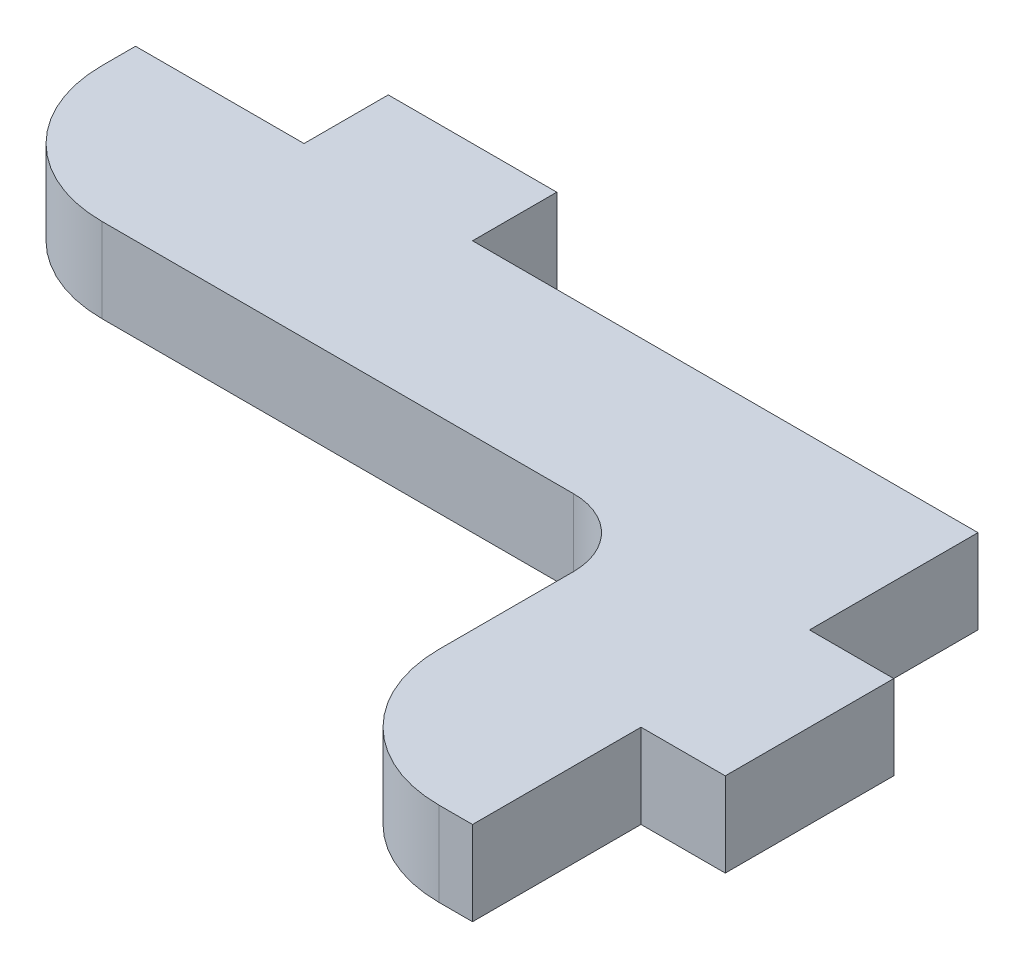
ISO-10303-21;
HEADER;
FILE_DESCRIPTION(('STEP AP214'),'2;1');
FILE_NAME('part.step','',(''),(''),'','','');
FILE_SCHEMA(('AUTOMOTIVE_DESIGN { 1 0 10303 214 1 1 1 1 }'));
ENDSEC;
DATA;
#1=APPLICATION_CONTEXT('core data for automotive mechanical design processes');
#2=APPLICATION_PROTOCOL_DEFINITION('international standard','automotive_design',2000,#1);
#3=PRODUCT_CONTEXT('',#1,'mechanical');
#4=PRODUCT('Part','Part','',(#3));
#5=PRODUCT_RELATED_PRODUCT_CATEGORY('part','',(#4));
#6=PRODUCT_DEFINITION_FORMATION('','',#4);
#7=PRODUCT_DEFINITION_CONTEXT('part definition',#1,'design');
#8=PRODUCT_DEFINITION('design','',#6,#7);
#9=PRODUCT_DEFINITION_SHAPE('','',#8);
#10=(LENGTH_UNIT() NAMED_UNIT(*) SI_UNIT(.MILLI.,.METRE.));
#11=(NAMED_UNIT(*) PLANE_ANGLE_UNIT() SI_UNIT($,.RADIAN.));
#12=(NAMED_UNIT(*) SI_UNIT($,.STERADIAN.) SOLID_ANGLE_UNIT());
#13=UNCERTAINTY_MEASURE_WITH_UNIT(LENGTH_MEASURE(1.E-05),#10,'distance_accuracy_value','');
#14=(GEOMETRIC_REPRESENTATION_CONTEXT(3) GLOBAL_UNCERTAINTY_ASSIGNED_CONTEXT((#13)) GLOBAL_UNIT_ASSIGNED_CONTEXT((#10,
#11,#12)) REPRESENTATION_CONTEXT('',''));
#15=CARTESIAN_POINT('',(0.,0.,0.));
#16=DIRECTION('',(0.,0.,1.));
#17=DIRECTION('',(1.,0.,0.));
#18=AXIS2_PLACEMENT_3D('',#15,#16,#17);
#19=CARTESIAN_POINT('',(50.,5.,20.));
#20=DIRECTION('',(-1.,0.,0.));
#21=DIRECTION('',(0.,0.,1.));
#22=AXIS2_PLACEMENT_3D('',#19,#20,#21);
#23=PLANE('',#22);
#24=DIRECTION('',(0.,0.,-1.));
#25=VECTOR('',#24,1.);
#26=CARTESIAN_POINT('',(50.,0.,20.));
#27=LINE('',#26,#25);
#28=CARTESIAN_POINT('',(50.,0.,20.));
#29=VERTEX_POINT('',#28);
#30=CARTESIAN_POINT('',(50.,0.,9.99999999999999));
#31=VERTEX_POINT('',#30);
#32=EDGE_CURVE('E185',#29,#31,#27,.T.);
#33=ORIENTED_EDGE('',*,*,#32,.T.);
#34=DIRECTION('',(0.,-1.,0.));
#35=VECTOR('',#34,1.);
#36=CARTESIAN_POINT('',(50.,5.,9.99999999999999));
#37=LINE('',#36,#35);
#38=CARTESIAN_POINT('',(50.,5.,9.99999999999999));
#39=VERTEX_POINT('',#38);
#40=EDGE_CURVE('E11',#39,#31,#37,.T.);
#41=ORIENTED_EDGE('',*,*,#40,.F.);
#42=DIRECTION('',(0.,0.,-1.));
#43=VECTOR('',#42,1.);
#44=CARTESIAN_POINT('',(50.,5.,20.));
#45=LINE('',#44,#43);
#46=CARTESIAN_POINT('',(50.,5.,20.));
#47=VERTEX_POINT('',#46);
#48=EDGE_CURVE('E217',#47,#39,#45,.T.);
#49=ORIENTED_EDGE('',*,*,#48,.F.);
#50=DIRECTION('',(0.,-1.,0.));
#51=VECTOR('',#50,1.);
#52=CARTESIAN_POINT('',(50.,5.,20.));
#53=LINE('',#52,#51);
#54=EDGE_CURVE('E181',#47,#29,#53,.T.);
#55=ORIENTED_EDGE('',*,*,#54,.T.);
#56=EDGE_LOOP('',(#33,#41,#49,#55));
#57=FACE_BOUND('',#56,.T.);
#58=ADVANCED_FACE('F35',(#57),#23,.F.);
#59=CARTESIAN_POINT('',(50.,5.,9.99999999999999));
#60=DIRECTION('',(0.,0.,-1.));
#61=DIRECTION('',(-1.,0.,0.));
#62=AXIS2_PLACEMENT_3D('',#59,#60,#61);
#63=PLANE('',#62);
#64=DIRECTION('',(1.,0.,0.));
#65=VECTOR('',#64,1.);
#66=CARTESIAN_POINT('',(50.,0.,9.99999999999999));
#67=LINE('',#66,#65);
#68=CARTESIAN_POINT('',(55.,0.,9.99999999999999));
#69=VERTEX_POINT('',#68);
#70=EDGE_CURVE('E188',#31,#69,#67,.T.);
#71=ORIENTED_EDGE('',*,*,#70,.T.);
#72=DIRECTION('',(0.,-1.,0.));
#73=VECTOR('',#72,1.);
#74=CARTESIAN_POINT('',(55.,5.,9.99999999999999));
#75=LINE('',#74,#73);
#76=CARTESIAN_POINT('',(55.,5.,9.99999999999999));
#77=VERTEX_POINT('',#76);
#78=EDGE_CURVE('E43',#77,#69,#75,.T.);
#79=ORIENTED_EDGE('',*,*,#78,.F.);
#80=DIRECTION('',(1.,0.,0.));
#81=VECTOR('',#80,1.);
#82=CARTESIAN_POINT('',(50.,5.,9.99999999999999));
#83=LINE('',#82,#81);
#84=EDGE_CURVE('E121',#39,#77,#83,.T.);
#85=ORIENTED_EDGE('',*,*,#84,.F.);
#86=ORIENTED_EDGE('',*,*,#40,.T.);
#87=EDGE_LOOP('',(#71,#79,#85,#86));
#88=FACE_BOUND('',#87,.T.);
#89=ADVANCED_FACE('F320',(#88),#63,.F.);
#90=CARTESIAN_POINT('',(55.,5.,0.));
#91=DIRECTION('',(-1.,0.,0.));
#92=DIRECTION('',(0.,0.,1.));
#93=AXIS2_PLACEMENT_3D('',#90,#91,#92);
#94=PLANE('',#93);
#95=DIRECTION('',(0.,0.,-1.));
#96=VECTOR('',#95,1.);
#97=CARTESIAN_POINT('',(55.,0.,0.));
#98=LINE('',#97,#96);
#99=CARTESIAN_POINT('',(55.,0.,0.));
#100=VERTEX_POINT('',#99);
#101=EDGE_CURVE('E190',#69,#100,#98,.T.);
#102=ORIENTED_EDGE('',*,*,#101,.T.);
#103=DIRECTION('',(0.,-1.,0.));
#104=VECTOR('',#103,1.);
#105=CARTESIAN_POINT('',(55.,5.,0.));
#106=LINE('',#105,#104);
#107=CARTESIAN_POINT('',(55.,5.,0.));
#108=VERTEX_POINT('',#107);
#109=EDGE_CURVE('E251',#108,#100,#106,.T.);
#110=ORIENTED_EDGE('',*,*,#109,.F.);
#111=DIRECTION('',(0.,0.,-1.));
#112=VECTOR('',#111,1.);
#113=CARTESIAN_POINT('',(55.,5.,0.));
#114=LINE('',#113,#112);
#115=EDGE_CURVE('E259',#77,#108,#114,.T.);
#116=ORIENTED_EDGE('',*,*,#115,.F.);
#117=ORIENTED_EDGE('',*,*,#78,.T.);
#118=EDGE_LOOP('',(#102,#110,#116,#117));
#119=FACE_BOUND('',#118,.T.);
#120=ADVANCED_FACE('F257',(#119),#94,.F.);
#121=CARTESIAN_POINT('',(50.,5.,0.));
#122=DIRECTION('',(0.,0.,1.));
#123=DIRECTION('',(1.,0.,0.));
#124=AXIS2_PLACEMENT_3D('',#121,#122,#123);
#125=PLANE('',#124);
#126=DIRECTION('',(-1.,0.,0.));
#127=VECTOR('',#126,1.);
#128=CARTESIAN_POINT('',(50.,0.,0.));
#129=LINE('',#128,#127);
#130=CARTESIAN_POINT('',(50.,0.,0.));
#131=VERTEX_POINT('',#130);
#132=EDGE_CURVE('E192',#100,#131,#129,.T.);
#133=ORIENTED_EDGE('',*,*,#132,.T.);
#134=DIRECTION('',(0.,-1.,0.));
#135=VECTOR('',#134,1.);
#136=CARTESIAN_POINT('',(50.,5.,0.));
#137=LINE('',#136,#135);
#138=CARTESIAN_POINT('',(50.,5.,0.));
#139=VERTEX_POINT('',#138);
#140=EDGE_CURVE('E248',#139,#131,#137,.T.);
#141=ORIENTED_EDGE('',*,*,#140,.F.);
#142=DIRECTION('',(-1.,0.,0.));
#143=VECTOR('',#142,1.);
#144=CARTESIAN_POINT('',(50.,5.,0.));
#145=LINE('',#144,#143);
#146=EDGE_CURVE('E277',#108,#139,#145,.T.);
#147=ORIENTED_EDGE('',*,*,#146,.F.);
#148=ORIENTED_EDGE('',*,*,#109,.T.);
#149=EDGE_LOOP('',(#133,#141,#147,#148));
#150=FACE_BOUND('',#149,.T.);
#151=ADVANCED_FACE('F268',(#150),#125,.F.);
#152=CARTESIAN_POINT('',(50.,5.,0.));
#153=DIRECTION('',(-1.,0.,0.));
#154=DIRECTION('',(0.,0.,1.));
#155=AXIS2_PLACEMENT_3D('',#152,#153,#154);
#156=PLANE('',#155);
#157=DIRECTION('',(0.,0.,-1.));
#158=VECTOR('',#157,1.);
#159=CARTESIAN_POINT('',(50.,0.,0.));
#160=LINE('',#159,#158);
#161=CARTESIAN_POINT('',(50.,0.,-10.));
#162=VERTEX_POINT('',#161);
#163=EDGE_CURVE('E194',#131,#162,#160,.T.);
#164=ORIENTED_EDGE('',*,*,#163,.T.);
#165=DIRECTION('',(0.,-1.,0.));
#166=VECTOR('',#165,1.);
#167=CARTESIAN_POINT('',(50.,5.,-10.));
#168=LINE('',#167,#166);
#169=CARTESIAN_POINT('',(50.,5.,-10.));
#170=VERTEX_POINT('',#169);
#171=EDGE_CURVE('E245',#170,#162,#168,.T.);
#172=ORIENTED_EDGE('',*,*,#171,.F.);
#173=DIRECTION('',(0.,0.,-1.));
#174=VECTOR('',#173,1.);
#175=CARTESIAN_POINT('',(50.,5.,0.));
#176=LINE('',#175,#174);
#177=EDGE_CURVE('E274',#139,#170,#176,.T.);
#178=ORIENTED_EDGE('',*,*,#177,.F.);
#179=ORIENTED_EDGE('',*,*,#140,.T.);
#180=EDGE_LOOP('',(#164,#172,#178,#179));
#181=FACE_BOUND('',#180,.T.);
#182=ADVANCED_FACE('F272',(#181),#156,.F.);
#183=CARTESIAN_POINT('',(50.,5.,-10.));
#184=DIRECTION('',(0.,0.,1.));
#185=DIRECTION('',(1.,0.,0.));
#186=AXIS2_PLACEMENT_3D('',#183,#184,#185);
#187=PLANE('',#186);
#188=DIRECTION('',(-1.,0.,0.));
#189=VECTOR('',#188,1.);
#190=CARTESIAN_POINT('',(50.,0.,-10.));
#191=LINE('',#190,#189);
#192=CARTESIAN_POINT('',(20.,0.,-10.));
#193=VERTEX_POINT('',#192);
#194=EDGE_CURVE('E196',#162,#193,#191,.T.);
#195=ORIENTED_EDGE('',*,*,#194,.T.);
#196=DIRECTION('',(0.,-1.,0.));
#197=VECTOR('',#196,1.);
#198=CARTESIAN_POINT('',(20.,5.,-10.));
#199=LINE('',#198,#197);
#200=CARTESIAN_POINT('',(20.,5.,-10.));
#201=VERTEX_POINT('',#200);
#202=EDGE_CURVE('E242',#201,#193,#199,.T.);
#203=ORIENTED_EDGE('',*,*,#202,.F.);
#204=DIRECTION('',(-1.,0.,0.));
#205=VECTOR('',#204,1.);
#206=CARTESIAN_POINT('',(50.,5.,-10.));
#207=LINE('',#206,#205);
#208=EDGE_CURVE('E276',#170,#201,#207,.T.);
#209=ORIENTED_EDGE('',*,*,#208,.F.);
#210=ORIENTED_EDGE('',*,*,#171,.T.);
#211=EDGE_LOOP('',(#195,#203,#209,#210));
#212=FACE_BOUND('',#211,.T.);
#213=ADVANCED_FACE('F333',(#212),#187,.F.);
#214=CARTESIAN_POINT('',(20.,5.,-10.));
#215=DIRECTION('',(-1.,0.,0.));
#216=DIRECTION('',(0.,0.,1.));
#217=AXIS2_PLACEMENT_3D('',#214,#215,#216);
#218=PLANE('',#217);
#219=DIRECTION('',(0.,0.,-1.));
#220=VECTOR('',#219,1.);
#221=CARTESIAN_POINT('',(20.,0.,-10.));
#222=LINE('',#221,#220);
#223=CARTESIAN_POINT('',(20.,0.,-15.));
#224=VERTEX_POINT('',#223);
#225=EDGE_CURVE('E198',#193,#224,#222,.T.);
#226=ORIENTED_EDGE('',*,*,#225,.T.);
#227=DIRECTION('',(0.,-1.,0.));
#228=VECTOR('',#227,1.);
#229=CARTESIAN_POINT('',(20.,5.,-15.));
#230=LINE('',#229,#228);
#231=CARTESIAN_POINT('',(20.,5.,-15.));
#232=VERTEX_POINT('',#231);
#233=EDGE_CURVE('E239',#232,#224,#230,.T.);
#234=ORIENTED_EDGE('',*,*,#233,.F.);
#235=DIRECTION('',(0.,0.,-1.));
#236=VECTOR('',#235,1.);
#237=CARTESIAN_POINT('',(20.,5.,-10.));
#238=LINE('',#237,#236);
#239=EDGE_CURVE('E279',#201,#232,#238,.T.);
#240=ORIENTED_EDGE('',*,*,#239,.F.);
#241=ORIENTED_EDGE('',*,*,#202,.T.);
#242=EDGE_LOOP('',(#226,#234,#240,#241));
#243=FACE_BOUND('',#242,.T.);
#244=ADVANCED_FACE('F336',(#243),#218,.F.);
#245=CARTESIAN_POINT('',(10.,5.,-15.));
#246=DIRECTION('',(0.,0.,1.));
#247=DIRECTION('',(1.,0.,0.));
#248=AXIS2_PLACEMENT_3D('',#245,#246,#247);
#249=PLANE('',#248);
#250=DIRECTION('',(-1.,0.,0.));
#251=VECTOR('',#250,1.);
#252=CARTESIAN_POINT('',(10.,0.,-15.));
#253=LINE('',#252,#251);
#254=CARTESIAN_POINT('',(10.,0.,-15.));
#255=VERTEX_POINT('',#254);
#256=EDGE_CURVE('E200',#224,#255,#253,.T.);
#257=ORIENTED_EDGE('',*,*,#256,.T.);
#258=DIRECTION('',(0.,-1.,0.));
#259=VECTOR('',#258,1.);
#260=CARTESIAN_POINT('',(10.,5.,-15.));
#261=LINE('',#260,#259);
#262=CARTESIAN_POINT('',(10.,5.,-15.));
#263=VERTEX_POINT('',#262);
#264=EDGE_CURVE('E236',#263,#255,#261,.T.);
#265=ORIENTED_EDGE('',*,*,#264,.F.);
#266=DIRECTION('',(-1.,0.,0.));
#267=VECTOR('',#266,1.);
#268=CARTESIAN_POINT('',(10.,5.,-15.));
#269=LINE('',#268,#267);
#270=EDGE_CURVE('E285',#232,#263,#269,.T.);
#271=ORIENTED_EDGE('',*,*,#270,.F.);
#272=ORIENTED_EDGE('',*,*,#233,.T.);
#273=EDGE_LOOP('',(#257,#265,#271,#272));
#274=FACE_BOUND('',#273,.T.);
#275=ADVANCED_FACE('F340',(#274),#249,.F.);
#276=CARTESIAN_POINT('',(10.,5.,-10.));
#277=DIRECTION('',(1.,0.,0.));
#278=DIRECTION('',(0.,0.,-1.));
#279=AXIS2_PLACEMENT_3D('',#276,#277,#278);
#280=PLANE('',#279);
#281=DIRECTION('',(0.,0.,1.));
#282=VECTOR('',#281,1.);
#283=CARTESIAN_POINT('',(10.,0.,-10.));
#284=LINE('',#283,#282);
#285=CARTESIAN_POINT('',(10.,0.,-10.));
#286=VERTEX_POINT('',#285);
#287=EDGE_CURVE('E202',#255,#286,#284,.T.);
#288=ORIENTED_EDGE('',*,*,#287,.T.);
#289=DIRECTION('',(0.,-1.,0.));
#290=VECTOR('',#289,1.);
#291=CARTESIAN_POINT('',(10.,5.,-10.));
#292=LINE('',#291,#290);
#293=CARTESIAN_POINT('',(10.,5.,-10.));
#294=VERTEX_POINT('',#293);
#295=EDGE_CURVE('E233',#294,#286,#292,.T.);
#296=ORIENTED_EDGE('',*,*,#295,.F.);
#297=DIRECTION('',(0.,0.,1.));
#298=VECTOR('',#297,1.);
#299=CARTESIAN_POINT('',(10.,5.,-10.));
#300=LINE('',#299,#298);
#301=EDGE_CURVE('E287',#263,#294,#300,.T.);
#302=ORIENTED_EDGE('',*,*,#301,.F.);
#303=ORIENTED_EDGE('',*,*,#264,.T.);
#304=EDGE_LOOP('',(#288,#296,#302,#303));
#305=FACE_BOUND('',#304,.T.);
#306=ADVANCED_FACE('F344',(#305),#280,.F.);
#307=CARTESIAN_POINT('',(10.,5.,-10.));
#308=DIRECTION('',(0.,0.,1.));
#309=DIRECTION('',(1.,0.,0.));
#310=AXIS2_PLACEMENT_3D('',#307,#308,#309);
#311=PLANE('',#310);
#312=DIRECTION('',(-1.,0.,0.));
#313=VECTOR('',#312,1.);
#314=CARTESIAN_POINT('',(10.,0.,-10.));
#315=LINE('',#314,#313);
#316=CARTESIAN_POINT('',(0.,0.,-10.));
#317=VERTEX_POINT('',#316);
#318=EDGE_CURVE('E204',#286,#317,#315,.T.);
#319=ORIENTED_EDGE('',*,*,#318,.T.);
#320=DIRECTION('',(0.,-1.,0.));
#321=VECTOR('',#320,1.);
#322=CARTESIAN_POINT('',(0.,5.,-10.));
#323=LINE('',#322,#321);
#324=CARTESIAN_POINT('',(0.,5.,-10.));
#325=VERTEX_POINT('',#324);
#326=EDGE_CURVE('E230',#325,#317,#323,.T.);
#327=ORIENTED_EDGE('',*,*,#326,.F.);
#328=DIRECTION('',(-1.,0.,0.));
#329=VECTOR('',#328,1.);
#330=CARTESIAN_POINT('',(10.,5.,-10.));
#331=LINE('',#330,#329);
#332=EDGE_CURVE('E289',#294,#325,#331,.T.);
#333=ORIENTED_EDGE('',*,*,#332,.F.);
#334=ORIENTED_EDGE('',*,*,#295,.T.);
#335=EDGE_LOOP('',(#319,#327,#333,#334));
#336=FACE_BOUND('',#335,.T.);
#337=ADVANCED_FACE('F348',(#336),#311,.F.);
#338=CARTESIAN_POINT('',(0.,5.,-10.));
#339=DIRECTION('',(1.,0.,0.));
#340=DIRECTION('',(0.,0.,-1.));
#341=AXIS2_PLACEMENT_3D('',#338,#339,#340);
#342=PLANE('',#341);
#343=DIRECTION('',(0.,0.,1.));
#344=VECTOR('',#343,1.);
#345=CARTESIAN_POINT('',(0.,0.,-10.));
#346=LINE('',#345,#344);
#347=CARTESIAN_POINT('',(0.,0.,-8.00000000000006));
#348=VERTEX_POINT('',#347);
#349=EDGE_CURVE('E206',#317,#348,#346,.T.);
#350=ORIENTED_EDGE('',*,*,#349,.T.);
#351=DIRECTION('',(0.,-1.,0.));
#352=VECTOR('',#351,1.);
#353=CARTESIAN_POINT('',(0.,5.,-8.00000000000006));
#354=LINE('',#353,#352);
#355=CARTESIAN_POINT('',(0.,5.,-8.00000000000006));
#356=VERTEX_POINT('',#355);
#357=EDGE_CURVE('E227',#356,#348,#354,.T.);
#358=ORIENTED_EDGE('',*,*,#357,.F.);
#359=DIRECTION('',(0.,0.,1.));
#360=VECTOR('',#359,1.);
#361=CARTESIAN_POINT('',(0.,5.,-10.));
#362=LINE('',#361,#360);
#363=EDGE_CURVE('E291',#325,#356,#362,.T.);
#364=ORIENTED_EDGE('',*,*,#363,.F.);
#365=ORIENTED_EDGE('',*,*,#326,.T.);
#366=EDGE_LOOP('',(#350,#358,#364,#365));
#367=FACE_BOUND('',#366,.T.);
#368=ADVANCED_FACE('F352',(#367),#342,.F.);
#369=CARTESIAN_POINT('',(8.,5.,-8.));
#370=DIRECTION('',(0.,-1.,0.));
#371=DIRECTION('',(0.,0.,-1.));
#372=AXIS2_PLACEMENT_3D('',#369,#370,#371);
#373=CYLINDRICAL_SURFACE('',#372,8.);
#374=CARTESIAN_POINT('',(8.,0.,-8.));
#375=DIRECTION('',(0.,1.,0.));
#376=DIRECTION('',(0.,0.,-1.));
#377=AXIS2_PLACEMENT_3D('',#374,#375,#376);
#378=CIRCLE('',#377,8.);
#379=CARTESIAN_POINT('',(8.00000000000006,0.,0.));
#380=VERTEX_POINT('',#379);
#381=EDGE_CURVE('E208',#348,#380,#378,.T.);
#382=ORIENTED_EDGE('',*,*,#381,.T.);
#383=DIRECTION('',(0.,-1.,0.));
#384=VECTOR('',#383,1.);
#385=CARTESIAN_POINT('',(8.00000000000006,5.,0.));
#386=LINE('',#385,#384);
#387=CARTESIAN_POINT('',(8.00000000000006,5.,0.));
#388=VERTEX_POINT('',#387);
#389=EDGE_CURVE('E224',#388,#380,#386,.T.);
#390=ORIENTED_EDGE('',*,*,#389,.F.);
#391=CARTESIAN_POINT('',(8.,5.,-8.));
#392=DIRECTION('',(0.,1.,0.));
#393=DIRECTION('',(0.,0.,-1.));
#394=AXIS2_PLACEMENT_3D('',#391,#392,#393);
#395=CIRCLE('',#394,8.);
#396=EDGE_CURVE('E293',#356,#388,#395,.T.);
#397=ORIENTED_EDGE('',*,*,#396,.F.);
#398=ORIENTED_EDGE('',*,*,#357,.T.);
#399=EDGE_LOOP('',(#382,#390,#397,#398));
#400=FACE_BOUND('',#399,.T.);
#401=ADVANCED_FACE('F356',(#400),#373,.T.);
#402=CARTESIAN_POINT('',(8.00000000000006,5.,0.));
#403=DIRECTION('',(0.,0.,-1.));
#404=DIRECTION('',(-1.,0.,0.));
#405=AXIS2_PLACEMENT_3D('',#402,#403,#404);
#406=PLANE('',#405);
#407=DIRECTION('',(1.,0.,0.));
#408=VECTOR('',#407,1.);
#409=CARTESIAN_POINT('',(8.00000000000006,0.,0.));
#410=LINE('',#409,#408);
#411=CARTESIAN_POINT('',(36.,0.,0.));
#412=VERTEX_POINT('',#411);
#413=EDGE_CURVE('E210',#380,#412,#410,.T.);
#414=ORIENTED_EDGE('',*,*,#413,.T.);
#415=DIRECTION('',(0.,-1.,0.));
#416=VECTOR('',#415,1.);
#417=CARTESIAN_POINT('',(36.,5.,0.));
#418=LINE('',#417,#416);
#419=CARTESIAN_POINT('',(36.,5.,0.));
#420=VERTEX_POINT('',#419);
#421=EDGE_CURVE('E221',#420,#412,#418,.T.);
#422=ORIENTED_EDGE('',*,*,#421,.F.);
#423=DIRECTION('',(1.,0.,0.));
#424=VECTOR('',#423,1.);
#425=CARTESIAN_POINT('',(8.00000000000006,5.,0.));
#426=LINE('',#425,#424);
#427=EDGE_CURVE('E295',#388,#420,#426,.T.);
#428=ORIENTED_EDGE('',*,*,#427,.F.);
#429=ORIENTED_EDGE('',*,*,#389,.T.);
#430=EDGE_LOOP('',(#414,#422,#428,#429));
#431=FACE_BOUND('',#430,.T.);
#432=ADVANCED_FACE('F301',(#431),#406,.F.);
#433=CARTESIAN_POINT('',(36.,5.,4.));
#434=DIRECTION('',(0.,-1.,0.));
#435=DIRECTION('',(0.,0.,-1.));
#436=AXIS2_PLACEMENT_3D('',#433,#434,#435);
#437=CYLINDRICAL_SURFACE('',#436,4.);
#438=CARTESIAN_POINT('',(36.,0.,4.));
#439=DIRECTION('',(0.,-1.,0.));
#440=DIRECTION('',(0.,0.,-1.));
#441=AXIS2_PLACEMENT_3D('',#438,#439,#440);
#442=CIRCLE('',#441,4.);
#443=CARTESIAN_POINT('',(40.,0.,4.00000000000003));
#444=VERTEX_POINT('',#443);
#445=EDGE_CURVE('E212',#412,#444,#442,.T.);
#446=ORIENTED_EDGE('',*,*,#445,.T.);
#447=DIRECTION('',(0.,-1.,0.));
#448=VECTOR('',#447,1.);
#449=CARTESIAN_POINT('',(40.,5.,4.00000000000003));
#450=LINE('',#449,#448);
#451=CARTESIAN_POINT('',(40.,5.,4.00000000000003));
#452=VERTEX_POINT('',#451);
#453=EDGE_CURVE('E176',#452,#444,#450,.T.);
#454=ORIENTED_EDGE('',*,*,#453,.F.);
#455=CARTESIAN_POINT('',(36.,5.,4.));
#456=DIRECTION('',(0.,-1.,0.));
#457=DIRECTION('',(0.,0.,-1.));
#458=AXIS2_PLACEMENT_3D('',#455,#456,#457);
#459=CIRCLE('',#458,4.);
#460=EDGE_CURVE('E167',#420,#452,#459,.T.);
#461=ORIENTED_EDGE('',*,*,#460,.F.);
#462=ORIENTED_EDGE('',*,*,#421,.T.);
#463=EDGE_LOOP('',(#446,#454,#461,#462));
#464=FACE_BOUND('',#463,.T.);
#465=ADVANCED_FACE('F305',(#464),#437,.F.);
#466=CARTESIAN_POINT('',(40.,5.,4.00000000000003));
#467=DIRECTION('',(1.,0.,0.));
#468=DIRECTION('',(0.,0.,-1.));
#469=AXIS2_PLACEMENT_3D('',#466,#467,#468);
#470=PLANE('',#469);
#471=DIRECTION('',(0.,0.,1.));
#472=VECTOR('',#471,1.);
#473=CARTESIAN_POINT('',(40.,0.,4.00000000000003));
#474=LINE('',#473,#472);
#475=CARTESIAN_POINT('',(40.,0.,11.9999999999999));
#476=VERTEX_POINT('',#475);
#477=EDGE_CURVE('E175',#444,#476,#474,.T.);
#478=ORIENTED_EDGE('',*,*,#477,.T.);
#479=DIRECTION('',(0.,-1.,0.));
#480=VECTOR('',#479,1.);
#481=CARTESIAN_POINT('',(40.,5.,11.9999999999999));
#482=LINE('',#481,#480);
#483=CARTESIAN_POINT('',(40.,5.,11.9999999999999));
#484=VERTEX_POINT('',#483);
#485=EDGE_CURVE('E172',#484,#476,#482,.T.);
#486=ORIENTED_EDGE('',*,*,#485,.F.);
#487=DIRECTION('',(0.,0.,1.));
#488=VECTOR('',#487,1.);
#489=CARTESIAN_POINT('',(40.,5.,4.00000000000003));
#490=LINE('',#489,#488);
#491=EDGE_CURVE('E161',#452,#484,#490,.T.);
#492=ORIENTED_EDGE('',*,*,#491,.F.);
#493=ORIENTED_EDGE('',*,*,#453,.T.);
#494=EDGE_LOOP('',(#478,#486,#492,#493));
#495=FACE_BOUND('',#494,.T.);
#496=ADVANCED_FACE('F173',(#495),#470,.F.);
#497=CARTESIAN_POINT('',(48.,5.,12.));
#498=DIRECTION('',(0.,-1.,0.));
#499=DIRECTION('',(0.,0.,-1.));
#500=AXIS2_PLACEMENT_3D('',#497,#498,#499);
#501=CYLINDRICAL_SURFACE('',#500,8.);
#502=CARTESIAN_POINT('',(48.,0.,12.));
#503=DIRECTION('',(0.,1.,0.));
#504=DIRECTION('',(0.,0.,1.));
#505=AXIS2_PLACEMENT_3D('',#502,#503,#504);
#506=CIRCLE('',#505,8.);
#507=CARTESIAN_POINT('',(48.0000000000001,0.,20.));
#508=VERTEX_POINT('',#507);
#509=EDGE_CURVE('E107',#476,#508,#506,.T.);
#510=ORIENTED_EDGE('',*,*,#509,.T.);
#511=DIRECTION('',(0.,-1.,0.));
#512=VECTOR('',#511,1.);
#513=CARTESIAN_POINT('',(48.0000000000001,5.,20.));
#514=LINE('',#513,#512);
#515=CARTESIAN_POINT('',(48.0000000000001,5.,20.));
#516=VERTEX_POINT('',#515);
#517=EDGE_CURVE('E177',#516,#508,#514,.T.);
#518=ORIENTED_EDGE('',*,*,#517,.F.);
#519=CARTESIAN_POINT('',(48.,5.,12.));
#520=DIRECTION('',(0.,1.,0.));
#521=DIRECTION('',(0.,0.,1.));
#522=AXIS2_PLACEMENT_3D('',#519,#520,#521);
#523=CIRCLE('',#522,8.);
#524=EDGE_CURVE('E165',#484,#516,#523,.T.);
#525=ORIENTED_EDGE('',*,*,#524,.F.);
#526=ORIENTED_EDGE('',*,*,#485,.T.);
#527=EDGE_LOOP('',(#510,#518,#525,#526));
#528=FACE_BOUND('',#527,.T.);
#529=ADVANCED_FACE('F179',(#528),#501,.T.);
#530=CARTESIAN_POINT('',(48.0000000000001,5.,20.));
#531=DIRECTION('',(0.,0.,-1.));
#532=DIRECTION('',(-1.,0.,0.));
#533=AXIS2_PLACEMENT_3D('',#530,#531,#532);
#534=PLANE('',#533);
#535=DIRECTION('',(1.,0.,0.));
#536=VECTOR('',#535,1.);
#537=CARTESIAN_POINT('',(48.0000000000001,0.,20.));
#538=LINE('',#537,#536);
#539=EDGE_CURVE('E113',#508,#29,#538,.T.);
#540=ORIENTED_EDGE('',*,*,#539,.T.);
#541=ORIENTED_EDGE('',*,*,#54,.F.);
#542=DIRECTION('',(1.,0.,0.));
#543=VECTOR('',#542,1.);
#544=CARTESIAN_POINT('',(48.0000000000001,5.,20.));
#545=LINE('',#544,#543);
#546=EDGE_CURVE('E51',#516,#47,#545,.T.);
#547=ORIENTED_EDGE('',*,*,#546,.F.);
#548=ORIENTED_EDGE('',*,*,#517,.T.);
#549=EDGE_LOOP('',(#540,#541,#547,#548));
#550=FACE_BOUND('',#549,.T.);
#551=ADVANCED_FACE('F309',(#550),#534,.F.);
#552=CARTESIAN_POINT('',(8.,5.,-8.));
#553=DIRECTION('',(0.,-1.,0.));
#554=DIRECTION('',(0.,0.,-1.));
#555=AXIS2_PLACEMENT_3D('',#552,#553,#554);
#556=PLANE('',#555);
#557=ORIENTED_EDGE('',*,*,#48,.T.);
#558=ORIENTED_EDGE('',*,*,#84,.T.);
#559=ORIENTED_EDGE('',*,*,#115,.T.);
#560=ORIENTED_EDGE('',*,*,#146,.T.);
#561=ORIENTED_EDGE('',*,*,#177,.T.);
#562=ORIENTED_EDGE('',*,*,#208,.T.);
#563=ORIENTED_EDGE('',*,*,#239,.T.);
#564=ORIENTED_EDGE('',*,*,#270,.T.);
#565=ORIENTED_EDGE('',*,*,#301,.T.);
#566=ORIENTED_EDGE('',*,*,#332,.T.);
#567=ORIENTED_EDGE('',*,*,#363,.T.);
#568=ORIENTED_EDGE('',*,*,#396,.T.);
#569=ORIENTED_EDGE('',*,*,#427,.T.);
#570=ORIENTED_EDGE('',*,*,#460,.T.);
#571=ORIENTED_EDGE('',*,*,#491,.T.);
#572=ORIENTED_EDGE('',*,*,#524,.T.);
#573=ORIENTED_EDGE('',*,*,#546,.T.);
#574=EDGE_LOOP('',(#557,#558,#559,#560,#561,#562,#563,#564,#565,#566,#567,#568,#569,#570,#571,
#572,#573));
#575=FACE_BOUND('',#574,.T.);
#576=ADVANCED_FACE('F163',(#575),#556,.F.);
#577=CARTESIAN_POINT('',(8.,0.,-8.));
#578=DIRECTION('',(0.,-1.,0.));
#579=DIRECTION('',(0.,0.,-1.));
#580=AXIS2_PLACEMENT_3D('',#577,#578,#579);
#581=PLANE('',#580);
#582=ORIENTED_EDGE('',*,*,#32,.F.);
#583=ORIENTED_EDGE('',*,*,#539,.F.);
#584=ORIENTED_EDGE('',*,*,#509,.F.);
#585=ORIENTED_EDGE('',*,*,#477,.F.);
#586=ORIENTED_EDGE('',*,*,#445,.F.);
#587=ORIENTED_EDGE('',*,*,#413,.F.);
#588=ORIENTED_EDGE('',*,*,#381,.F.);
#589=ORIENTED_EDGE('',*,*,#349,.F.);
#590=ORIENTED_EDGE('',*,*,#318,.F.);
#591=ORIENTED_EDGE('',*,*,#287,.F.);
#592=ORIENTED_EDGE('',*,*,#256,.F.);
#593=ORIENTED_EDGE('',*,*,#225,.F.);
#594=ORIENTED_EDGE('',*,*,#194,.F.);
#595=ORIENTED_EDGE('',*,*,#163,.F.);
#596=ORIENTED_EDGE('',*,*,#132,.F.);
#597=ORIENTED_EDGE('',*,*,#101,.F.);
#598=ORIENTED_EDGE('',*,*,#70,.F.);
#599=EDGE_LOOP('',(#582,#583,#584,#585,#586,#587,#588,#589,#590,#591,#592,#593,#594,#595,#596,
#597,#598));
#600=FACE_BOUND('',#599,.T.);
#601=ADVANCED_FACE('F263',(#600),#581,.T.);
#602=CLOSED_SHELL('',(#58,#89,#120,#151,#182,#213,#244,#275,#306,#337,#368,#401,#432,#465,#496,
#529,#551,#576,#601));
#603=MANIFOLD_SOLID_BREP('B2',#602);
#604=ADVANCED_BREP_SHAPE_REPRESENTATION('',(#18,#603),#14);
#605=SHAPE_DEFINITION_REPRESENTATION(#9,#604);
ENDSEC;
END-ISO-10303-21;
